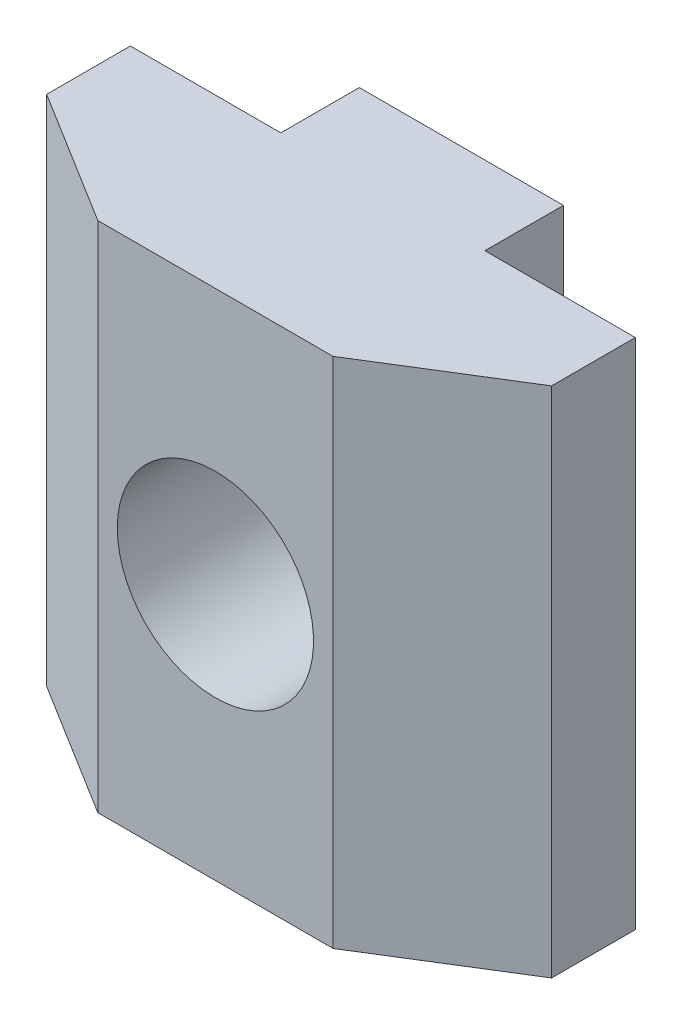
ISO-10303-21;
HEADER;
FILE_DESCRIPTION(('STEP AP214'),'2;1');
FILE_NAME('part.step','',(''),(''),'','','');
FILE_SCHEMA(('AUTOMOTIVE_DESIGN { 1 0 10303 214 1 1 1 1 }'));
ENDSEC;
DATA;
#1=APPLICATION_CONTEXT('core data for automotive mechanical design processes');
#2=APPLICATION_PROTOCOL_DEFINITION('international standard','automotive_design',2000,#1);
#3=PRODUCT_CONTEXT('',#1,'mechanical');
#4=PRODUCT('Part','Part','',(#3));
#5=PRODUCT_RELATED_PRODUCT_CATEGORY('part','',(#4));
#6=PRODUCT_DEFINITION_FORMATION('','',#4);
#7=PRODUCT_DEFINITION_CONTEXT('part definition',#1,'design');
#8=PRODUCT_DEFINITION('design','',#6,#7);
#9=PRODUCT_DEFINITION_SHAPE('','',#8);
#10=(LENGTH_UNIT() NAMED_UNIT(*) SI_UNIT(.MILLI.,.METRE.));
#11=(NAMED_UNIT(*) PLANE_ANGLE_UNIT() SI_UNIT($,.RADIAN.));
#12=(NAMED_UNIT(*) SI_UNIT($,.STERADIAN.) SOLID_ANGLE_UNIT());
#13=UNCERTAINTY_MEASURE_WITH_UNIT(LENGTH_MEASURE(1.E-05),#10,'distance_accuracy_value','');
#14=(GEOMETRIC_REPRESENTATION_CONTEXT(3) GLOBAL_UNCERTAINTY_ASSIGNED_CONTEXT((#13)) GLOBAL_UNIT_ASSIGNED_CONTEXT((#10,
#11,#12)) REPRESENTATION_CONTEXT('',''));
#15=CARTESIAN_POINT('',(0.,0.,0.));
#16=DIRECTION('',(0.,0.,1.));
#17=DIRECTION('',(1.,0.,0.));
#18=AXIS2_PLACEMENT_3D('',#15,#16,#17);
#19=CARTESIAN_POINT('',(-9.65,19.6,-3.2));
#20=DIRECTION('',(0.527403887753314,0.,-0.849614700427605));
#21=DIRECTION('',(-0.849614700427605,0.,-0.527403887753314));
#22=AXIS2_PLACEMENT_3D('',#19,#20,#21);
#23=PLANE('',#22);
#24=DIRECTION('',(0.849614700427605,0.,0.527403887753314));
#25=VECTOR('',#24,1.);
#26=CARTESIAN_POINT('',(-9.65,0.,-3.2));
#27=LINE('',#26,#25);
#28=CARTESIAN_POINT('',(-9.65,0.,-3.2));
#29=VERTEX_POINT('',#28);
#30=CARTESIAN_POINT('',(-4.495,0.,0.));
#31=VERTEX_POINT('',#30);
#32=EDGE_CURVE('E146',#29,#31,#27,.T.);
#33=ORIENTED_EDGE('',*,*,#32,.T.);
#34=DIRECTION('',(0.,-1.,0.));
#35=VECTOR('',#34,1.);
#36=CARTESIAN_POINT('',(-4.495,19.6,0.));
#37=LINE('',#36,#35);
#38=CARTESIAN_POINT('',(-4.495,19.6,0.));
#39=VERTEX_POINT('',#38);
#40=EDGE_CURVE('E11',#39,#31,#37,.T.);
#41=ORIENTED_EDGE('',*,*,#40,.F.);
#42=DIRECTION('',(0.849614700427605,0.,0.527403887753314));
#43=VECTOR('',#42,1.);
#44=CARTESIAN_POINT('',(-9.65,19.6,-3.2));
#45=LINE('',#44,#43);
#46=CARTESIAN_POINT('',(-9.65,19.6,-3.2));
#47=VERTEX_POINT('',#46);
#48=EDGE_CURVE('E170',#47,#39,#45,.T.);
#49=ORIENTED_EDGE('',*,*,#48,.F.);
#50=DIRECTION('',(0.,-1.,0.));
#51=VECTOR('',#50,1.);
#52=CARTESIAN_POINT('',(-9.65,19.6,-3.2));
#53=LINE('',#52,#51);
#54=EDGE_CURVE('E145',#47,#29,#53,.T.);
#55=ORIENTED_EDGE('',*,*,#54,.T.);
#56=EDGE_LOOP('',(#33,#41,#49,#55));
#57=FACE_BOUND('',#56,.T.);
#58=ADVANCED_FACE('F37',(#57),#23,.F.);
#59=CARTESIAN_POINT('',(-4.495,19.6,0.));
#60=DIRECTION('',(0.,0.,-1.));
#61=DIRECTION('',(-1.,0.,0.));
#62=AXIS2_PLACEMENT_3D('',#59,#60,#61);
#63=PLANE('',#62);
#64=CARTESIAN_POINT('',(0.,9.8,0.));
#65=DIRECTION('',(0.,0.,-1.));
#66=DIRECTION('',(-1.,0.,0.));
#67=AXIS2_PLACEMENT_3D('',#64,#65,#66);
#68=CIRCLE('',#67,3.75);
#69=CARTESIAN_POINT('',(-3.75,9.8,0.));
#70=VERTEX_POINT('',#69);
#71=EDGE_CURVE('E155',#70,#70,#68,.T.);
#72=ORIENTED_EDGE('',*,*,#71,.T.);
#73=EDGE_LOOP('',(#72));
#74=FACE_BOUND('',#73,.T.);
#75=DIRECTION('',(1.,0.,0.));
#76=VECTOR('',#75,1.);
#77=CARTESIAN_POINT('',(-4.495,0.,0.));
#78=LINE('',#77,#76);
#79=CARTESIAN_POINT('',(4.495,0.,0.));
#80=VERTEX_POINT('',#79);
#81=EDGE_CURVE('E151',#31,#80,#78,.T.);
#82=ORIENTED_EDGE('',*,*,#81,.T.);
#83=DIRECTION('',(0.,-1.,0.));
#84=VECTOR('',#83,1.);
#85=CARTESIAN_POINT('',(4.495,19.6,0.));
#86=LINE('',#85,#84);
#87=CARTESIAN_POINT('',(4.495,19.6,0.));
#88=VERTEX_POINT('',#87);
#89=EDGE_CURVE('E48',#88,#80,#86,.T.);
#90=ORIENTED_EDGE('',*,*,#89,.F.);
#91=DIRECTION('',(1.,0.,0.));
#92=VECTOR('',#91,1.);
#93=CARTESIAN_POINT('',(-4.495,19.6,0.));
#94=LINE('',#93,#92);
#95=EDGE_CURVE('E104',#39,#88,#94,.T.);
#96=ORIENTED_EDGE('',*,*,#95,.F.);
#97=ORIENTED_EDGE('',*,*,#40,.T.);
#98=EDGE_LOOP('',(#82,#90,#96,#97));
#99=FACE_BOUND('',#98,.T.);
#100=ADVANCED_FACE('F219',(#74,#99),#63,.F.);
#101=CARTESIAN_POINT('',(4.495,19.6,0.));
#102=DIRECTION('',(-0.527403887753315,0.,-0.849614700427605));
#103=DIRECTION('',(-0.849614700427605,0.,0.527403887753315));
#104=AXIS2_PLACEMENT_3D('',#101,#102,#103);
#105=PLANE('',#104);
#106=DIRECTION('',(0.849614700427605,0.,-0.527403887753315));
#107=VECTOR('',#106,1.);
#108=CARTESIAN_POINT('',(4.495,0.,0.));
#109=LINE('',#108,#107);
#110=CARTESIAN_POINT('',(9.65,0.,-3.2));
#111=VERTEX_POINT('',#110);
#112=EDGE_CURVE('E152',#80,#111,#109,.T.);
#113=ORIENTED_EDGE('',*,*,#112,.T.);
#114=DIRECTION('',(0.,-1.,0.));
#115=VECTOR('',#114,1.);
#116=CARTESIAN_POINT('',(9.65,19.6,-3.2));
#117=LINE('',#116,#115);
#118=CARTESIAN_POINT('',(9.65,19.6,-3.2));
#119=VERTEX_POINT('',#118);
#120=EDGE_CURVE('E177',#119,#111,#117,.T.);
#121=ORIENTED_EDGE('',*,*,#120,.F.);
#122=DIRECTION('',(0.849614700427605,0.,-0.527403887753315));
#123=VECTOR('',#122,1.);
#124=CARTESIAN_POINT('',(4.495,19.6,0.));
#125=LINE('',#124,#123);
#126=EDGE_CURVE('E189',#88,#119,#125,.T.);
#127=ORIENTED_EDGE('',*,*,#126,.F.);
#128=ORIENTED_EDGE('',*,*,#89,.T.);
#129=EDGE_LOOP('',(#113,#121,#127,#128));
#130=FACE_BOUND('',#129,.T.);
#131=ADVANCED_FACE('F186',(#130),#105,.F.);
#132=CARTESIAN_POINT('',(9.65,19.6,-3.2));
#133=DIRECTION('',(-1.,0.,0.));
#134=DIRECTION('',(0.,0.,1.));
#135=AXIS2_PLACEMENT_3D('',#132,#133,#134);
#136=PLANE('',#135);
#137=DIRECTION('',(0.,0.,-1.));
#138=VECTOR('',#137,1.);
#139=CARTESIAN_POINT('',(9.65,0.,-3.2));
#140=LINE('',#139,#138);
#141=CARTESIAN_POINT('',(9.65,0.,-6.4));
#142=VERTEX_POINT('',#141);
#143=EDGE_CURVE('E156',#111,#142,#140,.T.);
#144=ORIENTED_EDGE('',*,*,#143,.T.);
#145=DIRECTION('',(0.,-1.,0.));
#146=VECTOR('',#145,1.);
#147=CARTESIAN_POINT('',(9.65,19.6,-6.4));
#148=LINE('',#147,#146);
#149=CARTESIAN_POINT('',(9.65,19.6,-6.4));
#150=VERTEX_POINT('',#149);
#151=EDGE_CURVE('E176',#150,#142,#148,.T.);
#152=ORIENTED_EDGE('',*,*,#151,.F.);
#153=DIRECTION('',(0.,0.,-1.));
#154=VECTOR('',#153,1.);
#155=CARTESIAN_POINT('',(9.65,19.6,-3.2));
#156=LINE('',#155,#154);
#157=EDGE_CURVE('E206',#119,#150,#156,.T.);
#158=ORIENTED_EDGE('',*,*,#157,.F.);
#159=ORIENTED_EDGE('',*,*,#120,.T.);
#160=EDGE_LOOP('',(#144,#152,#158,#159));
#161=FACE_BOUND('',#160,.T.);
#162=ADVANCED_FACE('F197',(#161),#136,.F.);
#163=CARTESIAN_POINT('',(9.65,19.6,-6.4));
#164=DIRECTION('',(0.,0.,1.));
#165=DIRECTION('',(1.,0.,0.));
#166=AXIS2_PLACEMENT_3D('',#163,#164,#165);
#167=PLANE('',#166);
#168=DIRECTION('',(-1.,0.,0.));
#169=VECTOR('',#168,1.);
#170=CARTESIAN_POINT('',(9.65,0.,-6.4));
#171=LINE('',#170,#169);
#172=CARTESIAN_POINT('',(3.9,0.,-6.4));
#173=VERTEX_POINT('',#172);
#174=EDGE_CURVE('E158',#142,#173,#171,.T.);
#175=ORIENTED_EDGE('',*,*,#174,.T.);
#176=DIRECTION('',(0.,-1.,0.));
#177=VECTOR('',#176,1.);
#178=CARTESIAN_POINT('',(3.9,19.6,-6.4));
#179=LINE('',#178,#177);
#180=CARTESIAN_POINT('',(3.9,19.6,-6.4));
#181=VERTEX_POINT('',#180);
#182=EDGE_CURVE('E173',#181,#173,#179,.T.);
#183=ORIENTED_EDGE('',*,*,#182,.F.);
#184=DIRECTION('',(-1.,0.,0.));
#185=VECTOR('',#184,1.);
#186=CARTESIAN_POINT('',(9.65,19.6,-6.4));
#187=LINE('',#186,#185);
#188=EDGE_CURVE('E201',#150,#181,#187,.T.);
#189=ORIENTED_EDGE('',*,*,#188,.F.);
#190=ORIENTED_EDGE('',*,*,#151,.T.);
#191=EDGE_LOOP('',(#175,#183,#189,#190));
#192=FACE_BOUND('',#191,.T.);
#193=ADVANCED_FACE('F203',(#192),#167,.F.);
#194=CARTESIAN_POINT('',(3.9,19.6,-6.4));
#195=DIRECTION('',(-1.,0.,0.));
#196=DIRECTION('',(0.,0.,1.));
#197=AXIS2_PLACEMENT_3D('',#194,#195,#196);
#198=PLANE('',#197);
#199=DIRECTION('',(0.,0.,-1.));
#200=VECTOR('',#199,1.);
#201=CARTESIAN_POINT('',(3.9,0.,-6.4));
#202=LINE('',#201,#200);
#203=CARTESIAN_POINT('',(3.9,0.,-9.4));
#204=VERTEX_POINT('',#203);
#205=EDGE_CURVE('E159',#173,#204,#202,.T.);
#206=ORIENTED_EDGE('',*,*,#205,.T.);
#207=DIRECTION('',(0.,-1.,0.));
#208=VECTOR('',#207,1.);
#209=CARTESIAN_POINT('',(3.9,19.6,-9.4));
#210=LINE('',#209,#208);
#211=CARTESIAN_POINT('',(3.9,19.6,-9.4));
#212=VERTEX_POINT('',#211);
#213=EDGE_CURVE('E171',#212,#204,#210,.T.);
#214=ORIENTED_EDGE('',*,*,#213,.F.);
#215=DIRECTION('',(0.,0.,-1.));
#216=VECTOR('',#215,1.);
#217=CARTESIAN_POINT('',(3.9,19.6,-6.4));
#218=LINE('',#217,#216);
#219=EDGE_CURVE('E202',#181,#212,#218,.T.);
#220=ORIENTED_EDGE('',*,*,#219,.F.);
#221=ORIENTED_EDGE('',*,*,#182,.T.);
#222=EDGE_LOOP('',(#206,#214,#220,#221));
#223=FACE_BOUND('',#222,.T.);
#224=ADVANCED_FACE('F234',(#223),#198,.F.);
#225=CARTESIAN_POINT('',(3.9,19.6,-9.4));
#226=DIRECTION('',(0.,0.,1.));
#227=DIRECTION('',(1.,0.,0.));
#228=AXIS2_PLACEMENT_3D('',#225,#226,#227);
#229=PLANE('',#228);
#230=CARTESIAN_POINT('',(0.,9.8,-9.4));
#231=DIRECTION('',(0.,0.,-1.));
#232=DIRECTION('',(-1.,0.,0.));
#233=AXIS2_PLACEMENT_3D('',#230,#231,#232);
#234=CIRCLE('',#233,3.75);
#235=CARTESIAN_POINT('',(-3.75,9.8,-9.4));
#236=VERTEX_POINT('',#235);
#237=EDGE_CURVE('E212',#236,#236,#234,.T.);
#238=ORIENTED_EDGE('',*,*,#237,.F.);
#239=EDGE_LOOP('',(#238));
#240=FACE_BOUND('',#239,.T.);
#241=DIRECTION('',(-1.,0.,0.));
#242=VECTOR('',#241,1.);
#243=CARTESIAN_POINT('',(3.9,0.,-9.4));
#244=LINE('',#243,#242);
#245=CARTESIAN_POINT('',(-3.9,0.,-9.4));
#246=VERTEX_POINT('',#245);
#247=EDGE_CURVE('E165',#204,#246,#244,.T.);
#248=ORIENTED_EDGE('',*,*,#247,.T.);
#249=DIRECTION('',(0.,-1.,0.));
#250=VECTOR('',#249,1.);
#251=CARTESIAN_POINT('',(-3.9,19.6,-9.4));
#252=LINE('',#251,#250);
#253=CARTESIAN_POINT('',(-3.9,19.6,-9.4));
#254=VERTEX_POINT('',#253);
#255=EDGE_CURVE('E136',#254,#246,#252,.T.);
#256=ORIENTED_EDGE('',*,*,#255,.F.);
#257=DIRECTION('',(-1.,0.,0.));
#258=VECTOR('',#257,1.);
#259=CARTESIAN_POINT('',(3.9,19.6,-9.4));
#260=LINE('',#259,#258);
#261=EDGE_CURVE('E128',#212,#254,#260,.T.);
#262=ORIENTED_EDGE('',*,*,#261,.F.);
#263=ORIENTED_EDGE('',*,*,#213,.T.);
#264=EDGE_LOOP('',(#248,#256,#262,#263));
#265=FACE_BOUND('',#264,.T.);
#266=ADVANCED_FACE('F229',(#240,#265),#229,.F.);
#267=CARTESIAN_POINT('',(-3.9,19.6,-9.4));
#268=DIRECTION('',(1.,0.,0.));
#269=DIRECTION('',(0.,0.,-1.));
#270=AXIS2_PLACEMENT_3D('',#267,#268,#269);
#271=PLANE('',#270);
#272=DIRECTION('',(0.,0.,1.));
#273=VECTOR('',#272,1.);
#274=CARTESIAN_POINT('',(-3.9,0.,-9.4));
#275=LINE('',#274,#273);
#276=CARTESIAN_POINT('',(-3.9,0.,-6.4));
#277=VERTEX_POINT('',#276);
#278=EDGE_CURVE('E139',#246,#277,#275,.T.);
#279=ORIENTED_EDGE('',*,*,#278,.T.);
#280=DIRECTION('',(0.,-1.,0.));
#281=VECTOR('',#280,1.);
#282=CARTESIAN_POINT('',(-3.9,19.6,-6.4));
#283=LINE('',#282,#281);
#284=CARTESIAN_POINT('',(-3.9,19.6,-6.4));
#285=VERTEX_POINT('',#284);
#286=EDGE_CURVE('E135',#285,#277,#283,.T.);
#287=ORIENTED_EDGE('',*,*,#286,.F.);
#288=DIRECTION('',(0.,0.,1.));
#289=VECTOR('',#288,1.);
#290=CARTESIAN_POINT('',(-3.9,19.6,-9.4));
#291=LINE('',#290,#289);
#292=EDGE_CURVE('E123',#254,#285,#291,.T.);
#293=ORIENTED_EDGE('',*,*,#292,.F.);
#294=ORIENTED_EDGE('',*,*,#255,.T.);
#295=EDGE_LOOP('',(#279,#287,#293,#294));
#296=FACE_BOUND('',#295,.T.);
#297=ADVANCED_FACE('F137',(#296),#271,.F.);
#298=CARTESIAN_POINT('',(-3.9,19.6,-6.4));
#299=DIRECTION('',(0.,0.,1.));
#300=DIRECTION('',(1.,0.,0.));
#301=AXIS2_PLACEMENT_3D('',#298,#299,#300);
#302=PLANE('',#301);
#303=DIRECTION('',(-1.,0.,0.));
#304=VECTOR('',#303,1.);
#305=CARTESIAN_POINT('',(-3.9,0.,-6.4));
#306=LINE('',#305,#304);
#307=CARTESIAN_POINT('',(-9.65,0.,-6.4));
#308=VERTEX_POINT('',#307);
#309=EDGE_CURVE('E93',#277,#308,#306,.T.);
#310=ORIENTED_EDGE('',*,*,#309,.T.);
#311=DIRECTION('',(0.,-1.,0.));
#312=VECTOR('',#311,1.);
#313=CARTESIAN_POINT('',(-9.65,19.6,-6.4));
#314=LINE('',#313,#312);
#315=CARTESIAN_POINT('',(-9.65,19.6,-6.4));
#316=VERTEX_POINT('',#315);
#317=EDGE_CURVE('E138',#316,#308,#314,.T.);
#318=ORIENTED_EDGE('',*,*,#317,.F.);
#319=DIRECTION('',(-1.,0.,0.));
#320=VECTOR('',#319,1.);
#321=CARTESIAN_POINT('',(-3.9,19.6,-6.4));
#322=LINE('',#321,#320);
#323=EDGE_CURVE('E126',#285,#316,#322,.T.);
#324=ORIENTED_EDGE('',*,*,#323,.F.);
#325=ORIENTED_EDGE('',*,*,#286,.T.);
#326=EDGE_LOOP('',(#310,#318,#324,#325));
#327=FACE_BOUND('',#326,.T.);
#328=ADVANCED_FACE('F142',(#327),#302,.F.);
#329=CARTESIAN_POINT('',(-9.65,19.6,-6.4));
#330=DIRECTION('',(1.,0.,0.));
#331=DIRECTION('',(0.,0.,-1.));
#332=AXIS2_PLACEMENT_3D('',#329,#330,#331);
#333=PLANE('',#332);
#334=DIRECTION('',(0.,0.,1.));
#335=VECTOR('',#334,1.);
#336=CARTESIAN_POINT('',(-9.65,0.,-6.4));
#337=LINE('',#336,#335);
#338=EDGE_CURVE('E100',#308,#29,#337,.T.);
#339=ORIENTED_EDGE('',*,*,#338,.T.);
#340=ORIENTED_EDGE('',*,*,#54,.F.);
#341=DIRECTION('',(0.,0.,1.));
#342=VECTOR('',#341,1.);
#343=CARTESIAN_POINT('',(-9.65,19.6,-6.4));
#344=LINE('',#343,#342);
#345=EDGE_CURVE('E57',#316,#47,#344,.T.);
#346=ORIENTED_EDGE('',*,*,#345,.F.);
#347=ORIENTED_EDGE('',*,*,#317,.T.);
#348=EDGE_LOOP('',(#339,#340,#346,#347));
#349=FACE_BOUND('',#348,.T.);
#350=ADVANCED_FACE('F236',(#349),#333,.F.);
#351=CARTESIAN_POINT('',(0.,19.6,0.));
#352=DIRECTION('',(0.,1.,0.));
#353=DIRECTION('',(0.,0.,1.));
#354=AXIS2_PLACEMENT_3D('',#351,#352,#353);
#355=PLANE('',#354);
#356=ORIENTED_EDGE('',*,*,#48,.T.);
#357=ORIENTED_EDGE('',*,*,#95,.T.);
#358=ORIENTED_EDGE('',*,*,#126,.T.);
#359=ORIENTED_EDGE('',*,*,#157,.T.);
#360=ORIENTED_EDGE('',*,*,#188,.T.);
#361=ORIENTED_EDGE('',*,*,#219,.T.);
#362=ORIENTED_EDGE('',*,*,#261,.T.);
#363=ORIENTED_EDGE('',*,*,#292,.T.);
#364=ORIENTED_EDGE('',*,*,#323,.T.);
#365=ORIENTED_EDGE('',*,*,#345,.T.);
#366=EDGE_LOOP('',(#356,#357,#358,#359,#360,#361,#362,#363,#364,#365));
#367=FACE_BOUND('',#366,.T.);
#368=ADVANCED_FACE('F127',(#367),#355,.T.);
#369=CARTESIAN_POINT('',(0.,0.,0.));
#370=DIRECTION('',(0.,1.,0.));
#371=DIRECTION('',(0.,0.,1.));
#372=AXIS2_PLACEMENT_3D('',#369,#370,#371);
#373=PLANE('',#372);
#374=ORIENTED_EDGE('',*,*,#32,.F.);
#375=ORIENTED_EDGE('',*,*,#338,.F.);
#376=ORIENTED_EDGE('',*,*,#309,.F.);
#377=ORIENTED_EDGE('',*,*,#278,.F.);
#378=ORIENTED_EDGE('',*,*,#247,.F.);
#379=ORIENTED_EDGE('',*,*,#205,.F.);
#380=ORIENTED_EDGE('',*,*,#174,.F.);
#381=ORIENTED_EDGE('',*,*,#143,.F.);
#382=ORIENTED_EDGE('',*,*,#112,.F.);
#383=ORIENTED_EDGE('',*,*,#81,.F.);
#384=EDGE_LOOP('',(#374,#375,#376,#377,#378,#379,#380,#381,#382,#383));
#385=FACE_BOUND('',#384,.T.);
#386=ADVANCED_FACE('F195',(#385),#373,.F.);
#387=CARTESIAN_POINT('',(0.,9.8,0.));
#388=DIRECTION('',(0.,0.,-1.));
#389=DIRECTION('',(-1.,0.,0.));
#390=AXIS2_PLACEMENT_3D('',#387,#388,#389);
#391=CYLINDRICAL_SURFACE('',#390,3.75);
#392=CARTESIAN_POINT('',(-3.75,9.8,0.));
#393=CARTESIAN_POINT('',(-3.75,9.8,-0.0979166666666667));
#394=CARTESIAN_POINT('',(-3.75,9.8,-0.195833333333333));
#395=CARTESIAN_POINT('',(-3.75,9.8,-0.391666666666666));
#396=CARTESIAN_POINT('',(-3.75,9.8,-0.489583333333333));
#397=CARTESIAN_POINT('',(-3.75,9.8,-0.685416666666666));
#398=CARTESIAN_POINT('',(-3.75,9.8,-0.783333333333333));
#399=CARTESIAN_POINT('',(-3.75,9.8,-0.979166666666666));
#400=CARTESIAN_POINT('',(-3.75,9.8,-1.07708333333333));
#401=CARTESIAN_POINT('',(-3.75,9.8,-1.27291666666667));
#402=CARTESIAN_POINT('',(-3.75,9.8,-1.37083333333333));
#403=CARTESIAN_POINT('',(-3.75,9.8,-1.56666666666667));
#404=CARTESIAN_POINT('',(-3.75,9.8,-1.66458333333333));
#405=CARTESIAN_POINT('',(-3.75,9.8,-1.86041666666667));
#406=CARTESIAN_POINT('',(-3.75,9.8,-1.95833333333333));
#407=CARTESIAN_POINT('',(-3.75,9.8,-2.15416666666667));
#408=CARTESIAN_POINT('',(-3.75,9.8,-2.25208333333333));
#409=CARTESIAN_POINT('',(-3.75,9.8,-2.44791666666667));
#410=CARTESIAN_POINT('',(-3.75,9.8,-2.54583333333333));
#411=CARTESIAN_POINT('',(-3.75,9.8,-2.74166666666667));
#412=CARTESIAN_POINT('',(-3.75,9.8,-2.83958333333333));
#413=CARTESIAN_POINT('',(-3.75,9.8,-3.03541666666667));
#414=CARTESIAN_POINT('',(-3.75,9.8,-3.13333333333333));
#415=CARTESIAN_POINT('',(-3.75,9.8,-3.32916666666667));
#416=CARTESIAN_POINT('',(-3.75,9.8,-3.42708333333333));
#417=CARTESIAN_POINT('',(-3.75,9.8,-3.62291666666667));
#418=CARTESIAN_POINT('',(-3.75,9.8,-3.72083333333333));
#419=CARTESIAN_POINT('',(-3.75,9.8,-3.91666666666667));
#420=CARTESIAN_POINT('',(-3.75,9.8,-4.01458333333333));
#421=CARTESIAN_POINT('',(-3.75,9.8,-4.21041666666667));
#422=CARTESIAN_POINT('',(-3.75,9.8,-4.30833333333333));
#423=CARTESIAN_POINT('',(-3.75,9.8,-4.50416666666666));
#424=CARTESIAN_POINT('',(-3.75,9.8,-4.60208333333333));
#425=CARTESIAN_POINT('',(-3.75,9.8,-4.79791666666666));
#426=CARTESIAN_POINT('',(-3.75,9.8,-4.89583333333333));
#427=CARTESIAN_POINT('',(-3.75,9.8,-5.09166666666666));
#428=CARTESIAN_POINT('',(-3.75,9.8,-5.18958333333333));
#429=CARTESIAN_POINT('',(-3.75,9.8,-5.38541666666667));
#430=CARTESIAN_POINT('',(-3.75,9.8,-5.48333333333333));
#431=CARTESIAN_POINT('',(-3.75,9.8,-5.67916666666666));
#432=CARTESIAN_POINT('',(-3.75,9.8,-5.77708333333333));
#433=CARTESIAN_POINT('',(-3.75,9.8,-5.97291666666666));
#434=CARTESIAN_POINT('',(-3.75,9.8,-6.07083333333333));
#435=CARTESIAN_POINT('',(-3.75,9.8,-6.26666666666666));
#436=CARTESIAN_POINT('',(-3.75,9.8,-6.36458333333333));
#437=CARTESIAN_POINT('',(-3.75,9.8,-6.56041666666667));
#438=CARTESIAN_POINT('',(-3.75,9.8,-6.65833333333333));
#439=CARTESIAN_POINT('',(-3.75,9.8,-6.85416666666666));
#440=CARTESIAN_POINT('',(-3.75,9.8,-6.95208333333333));
#441=CARTESIAN_POINT('',(-3.75,9.8,-7.14791666666666));
#442=CARTESIAN_POINT('',(-3.75,9.8,-7.24583333333333));
#443=CARTESIAN_POINT('',(-3.75,9.8,-7.44166666666666));
#444=CARTESIAN_POINT('',(-3.75,9.8,-7.53958333333333));
#445=CARTESIAN_POINT('',(-3.75,9.8,-7.73541666666666));
#446=CARTESIAN_POINT('',(-3.75,9.8,-7.83333333333333));
#447=CARTESIAN_POINT('',(-3.75,9.8,-8.02916666666666));
#448=CARTESIAN_POINT('',(-3.75,9.8,-8.12708333333333));
#449=CARTESIAN_POINT('',(-3.75,9.8,-8.32291666666666));
#450=CARTESIAN_POINT('',(-3.75,9.8,-8.42083333333333));
#451=CARTESIAN_POINT('',(-3.75,9.8,-8.61666666666666));
#452=CARTESIAN_POINT('',(-3.75,9.8,-8.71458333333333));
#453=CARTESIAN_POINT('',(-3.75,9.8,-8.91041666666666));
#454=CARTESIAN_POINT('',(-3.75,9.8,-9.00833333333333));
#455=CARTESIAN_POINT('',(-3.75,9.8,-9.20416666666666));
#456=CARTESIAN_POINT('',(-3.75,9.8,-9.30208333333333));
#457=CARTESIAN_POINT('',(-3.75,9.8,-9.4));
#458=B_SPLINE_CURVE_WITH_KNOTS('',3,(#392,#393,#394,#395,#396,#397,#398,#399,#400,#401,#402,
#403,#404,#405,#406,#407,#408,#409,#410,#411,#412,#413,#414,#415,#416,#417,#418,#419,#420,#421,
#422,#423,#424,#425,#426,#427,#428,#429,#430,#431,#432,#433,#434,#435,#436,#437,#438,#439,#440,
#441,#442,#443,#444,#445,#446,#447,#448,#449,#450,#451,#452,#453,#454,#455,#456,#457),
.UNSPECIFIED.,.F.,.F.,(4,2,2,2,2,2,2,2,2,2,2,2,2,2,2,2,2,2,2,2,2,2,2,2,2,2,2,2,2,2,2,2,4),(0.,
0.29375,0.5875,0.88125,1.175,1.46875,1.7625,2.05625,2.35,2.64375,2.9375,3.23125,3.525,3.81875,
4.1125,4.40625,4.7,4.99375,5.2875,5.58125,5.875,6.16875,6.4625,6.75625,7.05,7.34375,7.6375,
7.93125,8.225,8.51875,8.8125,9.10625,9.4),.UNSPECIFIED.);
#459=EDGE_CURVE('BSEAM225',#70,#236,#458,.T.);
#460=ORIENTED_EDGE('',*,*,#71,.F.);
#461=ORIENTED_EDGE('',*,*,#237,.T.);
#462=ORIENTED_EDGE('',*,*,#459,.T.);
#463=ORIENTED_EDGE('',*,*,#459,.F.);
#464=EDGE_LOOP('',(#460,#462,#461,#463));
#465=FACE_BOUND('',#464,.T.);
#466=ADVANCED_FACE('F225',(#465),#391,.F.);
#467=CLOSED_SHELL('',(#58,#100,#131,#162,#193,#224,#266,#297,#328,#350,#368,#386,#466));
#468=MANIFOLD_SOLID_BREP('B2',#467);
#469=ADVANCED_BREP_SHAPE_REPRESENTATION('',(#18,#468),#14);
#470=SHAPE_DEFINITION_REPRESENTATION(#9,#469);
ENDSEC;
END-ISO-10303-21;
